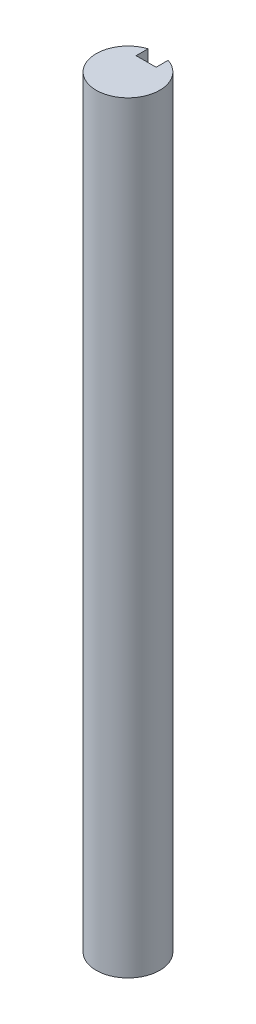
ISO-10303-21;
HEADER;
FILE_DESCRIPTION(('STEP AP214'),'2;1');
FILE_NAME('part.step','',(''),(''),'','','');
FILE_SCHEMA(('AUTOMOTIVE_DESIGN { 1 0 10303 214 1 1 1 1 }'));
ENDSEC;
DATA;
#1=APPLICATION_CONTEXT('core data for automotive mechanical design processes');
#2=APPLICATION_PROTOCOL_DEFINITION('international standard','automotive_design',2000,#1);
#3=PRODUCT_CONTEXT('',#1,'mechanical');
#4=PRODUCT('Part','Part','',(#3));
#5=PRODUCT_RELATED_PRODUCT_CATEGORY('part','',(#4));
#6=PRODUCT_DEFINITION_FORMATION('','',#4);
#7=PRODUCT_DEFINITION_CONTEXT('part definition',#1,'design');
#8=PRODUCT_DEFINITION('design','',#6,#7);
#9=PRODUCT_DEFINITION_SHAPE('','',#8);
#10=(LENGTH_UNIT() NAMED_UNIT(*) SI_UNIT(.MILLI.,.METRE.));
#11=(NAMED_UNIT(*) PLANE_ANGLE_UNIT() SI_UNIT($,.RADIAN.));
#12=(NAMED_UNIT(*) SI_UNIT($,.STERADIAN.) SOLID_ANGLE_UNIT());
#13=UNCERTAINTY_MEASURE_WITH_UNIT(LENGTH_MEASURE(1.E-05),#10,'distance_accuracy_value','');
#14=(GEOMETRIC_REPRESENTATION_CONTEXT(3) GLOBAL_UNCERTAINTY_ASSIGNED_CONTEXT((#13)) GLOBAL_UNIT_ASSIGNED_CONTEXT((#10,
#11,#12)) REPRESENTATION_CONTEXT('',''));
#15=CARTESIAN_POINT('',(0.,0.,0.));
#16=DIRECTION('',(0.,0.,1.));
#17=DIRECTION('',(1.,0.,0.));
#18=AXIS2_PLACEMENT_3D('',#15,#16,#17);
#19=CARTESIAN_POINT('',(0.,76.2,0.));
#20=DIRECTION('',(0.,-1.,0.));
#21=DIRECTION('',(0.,0.,-1.));
#22=AXIS2_PLACEMENT_3D('',#19,#20,#21);
#23=CYLINDRICAL_SURFACE('',#22,3.175);
#24=CARTESIAN_POINT('',(0.,0.,0.));
#25=DIRECTION('',(0.,1.,0.));
#26=DIRECTION('',(0.,0.,1.));
#27=AXIS2_PLACEMENT_3D('',#24,#25,#26);
#28=CIRCLE('',#27,3.175);
#29=CARTESIAN_POINT('',(-1.,0.,-3.01340753964677));
#30=VERTEX_POINT('',#29);
#31=CARTESIAN_POINT('',(1.,0.,-3.01340753964677));
#32=VERTEX_POINT('',#31);
#33=EDGE_CURVE('E97',#30,#32,#28,.T.);
#34=ORIENTED_EDGE('',*,*,#33,.T.);
#35=DIRECTION('',(0.,-1.,0.));
#36=VECTOR('',#35,1.);
#37=CARTESIAN_POINT('',(1.,76.2,-3.01340753964677));
#38=LINE('',#37,#36);
#39=CARTESIAN_POINT('',(1.,76.2,-3.01340753964677));
#40=VERTEX_POINT('',#39);
#41=EDGE_CURVE('E11',#40,#32,#38,.T.);
#42=ORIENTED_EDGE('',*,*,#41,.F.);
#43=CARTESIAN_POINT('',(0.,76.2,0.));
#44=DIRECTION('',(0.,1.,0.));
#45=DIRECTION('',(0.,0.,1.));
#46=AXIS2_PLACEMENT_3D('',#43,#44,#45);
#47=CIRCLE('',#46,3.175);
#48=CARTESIAN_POINT('',(-1.,76.2,-3.01340753964677));
#49=VERTEX_POINT('',#48);
#50=EDGE_CURVE('E85',#49,#40,#47,.T.);
#51=ORIENTED_EDGE('',*,*,#50,.F.);
#52=DIRECTION('',(0.,-1.,0.));
#53=VECTOR('',#52,1.);
#54=CARTESIAN_POINT('',(-1.,76.2,-3.01340753964677));
#55=LINE('',#54,#53);
#56=EDGE_CURVE('E93',#49,#30,#55,.T.);
#57=ORIENTED_EDGE('',*,*,#56,.T.);
#58=EDGE_LOOP('',(#34,#42,#51,#57));
#59=FACE_BOUND('',#58,.T.);
#60=ADVANCED_FACE('F34',(#59),#23,.T.);
#61=CARTESIAN_POINT('',(1.,76.2,-1.81340753964677));
#62=DIRECTION('',(1.,0.,0.));
#63=DIRECTION('',(0.,0.,-1.));
#64=AXIS2_PLACEMENT_3D('',#61,#62,#63);
#65=PLANE('',#64);
#66=DIRECTION('',(0.,0.,1.));
#67=VECTOR('',#66,1.);
#68=CARTESIAN_POINT('',(1.,0.,-1.81340753964677));
#69=LINE('',#68,#67);
#70=CARTESIAN_POINT('',(1.,0.,-1.81340753964677));
#71=VERTEX_POINT('',#70);
#72=EDGE_CURVE('E89',#32,#71,#69,.T.);
#73=ORIENTED_EDGE('',*,*,#72,.T.);
#74=DIRECTION('',(0.,-1.,0.));
#75=VECTOR('',#74,1.);
#76=CARTESIAN_POINT('',(1.,76.2,-1.81340753964677));
#77=LINE('',#76,#75);
#78=CARTESIAN_POINT('',(1.,76.2,-1.81340753964677));
#79=VERTEX_POINT('',#78);
#80=EDGE_CURVE('E42',#79,#71,#77,.T.);
#81=ORIENTED_EDGE('',*,*,#80,.F.);
#82=DIRECTION('',(0.,0.,1.));
#83=VECTOR('',#82,1.);
#84=CARTESIAN_POINT('',(1.,76.2,-1.81340753964677));
#85=LINE('',#84,#83);
#86=EDGE_CURVE('E80',#40,#79,#85,.T.);
#87=ORIENTED_EDGE('',*,*,#86,.F.);
#88=ORIENTED_EDGE('',*,*,#41,.T.);
#89=EDGE_LOOP('',(#73,#81,#87,#88));
#90=FACE_BOUND('',#89,.T.);
#91=ADVANCED_FACE('F88',(#90),#65,.F.);
#92=CARTESIAN_POINT('',(-1.,76.2,-1.81340753964677));
#93=DIRECTION('',(0.,0.,1.));
#94=DIRECTION('',(1.,0.,0.));
#95=AXIS2_PLACEMENT_3D('',#92,#93,#94);
#96=PLANE('',#95);
#97=DIRECTION('',(-1.,0.,0.));
#98=VECTOR('',#97,1.);
#99=CARTESIAN_POINT('',(-1.,0.,-1.81340753964677));
#100=LINE('',#99,#98);
#101=CARTESIAN_POINT('',(-1.,0.,-1.81340753964677));
#102=VERTEX_POINT('',#101);
#103=EDGE_CURVE('E67',#71,#102,#100,.T.);
#104=ORIENTED_EDGE('',*,*,#103,.T.);
#105=DIRECTION('',(0.,-1.,0.));
#106=VECTOR('',#105,1.);
#107=CARTESIAN_POINT('',(-1.,76.2,-1.81340753964677));
#108=LINE('',#107,#106);
#109=CARTESIAN_POINT('',(-1.,76.2,-1.81340753964677));
#110=VERTEX_POINT('',#109);
#111=EDGE_CURVE('E90',#110,#102,#108,.T.);
#112=ORIENTED_EDGE('',*,*,#111,.F.);
#113=DIRECTION('',(-1.,0.,0.));
#114=VECTOR('',#113,1.);
#115=CARTESIAN_POINT('',(-1.,76.2,-1.81340753964677));
#116=LINE('',#115,#114);
#117=EDGE_CURVE('E83',#79,#110,#116,.T.);
#118=ORIENTED_EDGE('',*,*,#117,.F.);
#119=ORIENTED_EDGE('',*,*,#80,.T.);
#120=EDGE_LOOP('',(#104,#112,#118,#119));
#121=FACE_BOUND('',#120,.T.);
#122=ADVANCED_FACE('F91',(#121),#96,.F.);
#123=CARTESIAN_POINT('',(-1.,76.2,-3.01340753964677));
#124=DIRECTION('',(-1.,0.,0.));
#125=DIRECTION('',(0.,0.,1.));
#126=AXIS2_PLACEMENT_3D('',#123,#124,#125);
#127=PLANE('',#126);
#128=DIRECTION('',(0.,0.,-1.));
#129=VECTOR('',#128,1.);
#130=CARTESIAN_POINT('',(-1.,0.,-3.01340753964677));
#131=LINE('',#130,#129);
#132=EDGE_CURVE('E73',#102,#30,#131,.T.);
#133=ORIENTED_EDGE('',*,*,#132,.T.);
#134=ORIENTED_EDGE('',*,*,#56,.F.);
#135=DIRECTION('',(0.,0.,-1.));
#136=VECTOR('',#135,1.);
#137=CARTESIAN_POINT('',(-1.,76.2,-3.01340753964677));
#138=LINE('',#137,#136);
#139=EDGE_CURVE('E50',#110,#49,#138,.T.);
#140=ORIENTED_EDGE('',*,*,#139,.F.);
#141=ORIENTED_EDGE('',*,*,#111,.T.);
#142=EDGE_LOOP('',(#133,#134,#140,#141));
#143=FACE_BOUND('',#142,.T.);
#144=ADVANCED_FACE('F104',(#143),#127,.F.);
#145=CARTESIAN_POINT('',(0.,76.2,0.));
#146=DIRECTION('',(0.,1.,0.));
#147=DIRECTION('',(0.,0.,1.));
#148=AXIS2_PLACEMENT_3D('',#145,#146,#147);
#149=PLANE('',#148);
#150=ORIENTED_EDGE('',*,*,#50,.T.);
#151=ORIENTED_EDGE('',*,*,#86,.T.);
#152=ORIENTED_EDGE('',*,*,#117,.T.);
#153=ORIENTED_EDGE('',*,*,#139,.T.);
#154=EDGE_LOOP('',(#150,#151,#152,#153));
#155=FACE_BOUND('',#154,.T.);
#156=ADVANCED_FACE('F81',(#155),#149,.T.);
#157=CARTESIAN_POINT('',(0.,0.,0.));
#158=DIRECTION('',(0.,1.,0.));
#159=DIRECTION('',(0.,0.,1.));
#160=AXIS2_PLACEMENT_3D('',#157,#158,#159);
#161=PLANE('',#160);
#162=ORIENTED_EDGE('',*,*,#33,.F.);
#163=ORIENTED_EDGE('',*,*,#132,.F.);
#164=ORIENTED_EDGE('',*,*,#103,.F.);
#165=ORIENTED_EDGE('',*,*,#72,.F.);
#166=EDGE_LOOP('',(#162,#163,#164,#165));
#167=FACE_BOUND('',#166,.T.);
#168=ADVANCED_FACE('F107',(#167),#161,.F.);
#169=CLOSED_SHELL('',(#60,#91,#122,#144,#156,#168));
#170=MANIFOLD_SOLID_BREP('B2',#169);
#171=ADVANCED_BREP_SHAPE_REPRESENTATION('',(#18,#170),#14);
#172=SHAPE_DEFINITION_REPRESENTATION(#9,#171);
ENDSEC;
END-ISO-10303-21;
